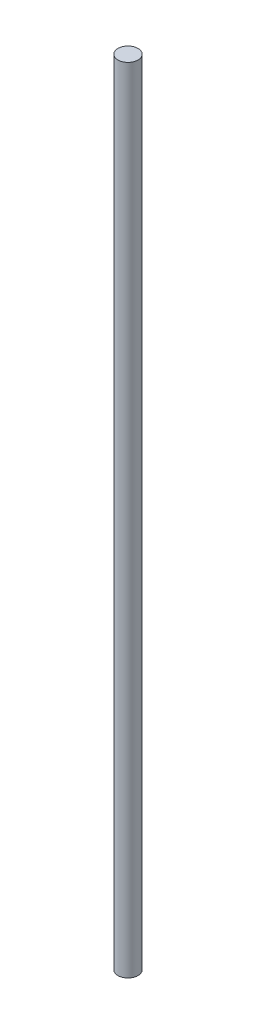
ISO-10303-21;
HEADER;
FILE_DESCRIPTION(('STEP AP214'),'2;1');
FILE_NAME('part.step','',(''),(''),'','','');
FILE_SCHEMA(('AUTOMOTIVE_DESIGN { 1 0 10303 214 1 1 1 1 }'));
ENDSEC;
DATA;
#1=APPLICATION_CONTEXT('core data for automotive mechanical design processes');
#2=APPLICATION_PROTOCOL_DEFINITION('international standard','automotive_design',2000,#1);
#3=PRODUCT_CONTEXT('',#1,'mechanical');
#4=PRODUCT('Part','Part','',(#3));
#5=PRODUCT_RELATED_PRODUCT_CATEGORY('part','',(#4));
#6=PRODUCT_DEFINITION_FORMATION('','',#4);
#7=PRODUCT_DEFINITION_CONTEXT('part definition',#1,'design');
#8=PRODUCT_DEFINITION('design','',#6,#7);
#9=PRODUCT_DEFINITION_SHAPE('','',#8);
#10=(LENGTH_UNIT() NAMED_UNIT(*) SI_UNIT(.MILLI.,.METRE.));
#11=(NAMED_UNIT(*) PLANE_ANGLE_UNIT() SI_UNIT($,.RADIAN.));
#12=(NAMED_UNIT(*) SI_UNIT($,.STERADIAN.) SOLID_ANGLE_UNIT());
#13=UNCERTAINTY_MEASURE_WITH_UNIT(LENGTH_MEASURE(1.E-05),#10,'distance_accuracy_value','');
#14=(GEOMETRIC_REPRESENTATION_CONTEXT(3) GLOBAL_UNCERTAINTY_ASSIGNED_CONTEXT((#13)) GLOBAL_UNIT_ASSIGNED_CONTEXT((#10,
#11,#12)) REPRESENTATION_CONTEXT('',''));
#15=CARTESIAN_POINT('',(0.,0.,0.));
#16=DIRECTION('',(0.,0.,1.));
#17=DIRECTION('',(1.,0.,0.));
#18=AXIS2_PLACEMENT_3D('',#15,#16,#17);
#19=CARTESIAN_POINT('',(0.,190.5,0.));
#20=DIRECTION('',(0.,-1.,0.));
#21=DIRECTION('',(0.,0.,-1.));
#22=AXIS2_PLACEMENT_3D('',#19,#20,#21);
#23=CYLINDRICAL_SURFACE('',#22,2.413);
#24=CARTESIAN_POINT('',(0.,190.5,0.));
#25=DIRECTION('',(0.,1.,0.));
#26=DIRECTION('',(0.,0.,1.));
#27=AXIS2_PLACEMENT_3D('',#24,#25,#26);
#28=CIRCLE('',#27,2.413);
#29=CARTESIAN_POINT('',(0.,190.5,2.413));
#30=VERTEX_POINT('',#29);
#31=EDGE_CURVE('E10',#30,#30,#28,.T.);
#32=ORIENTED_EDGE('',*,*,#31,.F.);
#33=EDGE_LOOP('',(#32));
#34=FACE_BOUND('',#33,.T.);
#35=CARTESIAN_POINT('',(0.,0.,0.));
#36=DIRECTION('',(0.,1.,0.));
#37=DIRECTION('',(0.,0.,1.));
#38=AXIS2_PLACEMENT_3D('',#35,#36,#37);
#39=CIRCLE('',#38,2.413);
#40=CARTESIAN_POINT('',(0.,0.,2.413));
#41=VERTEX_POINT('',#40);
#42=EDGE_CURVE('E40',#41,#41,#39,.T.);
#43=ORIENTED_EDGE('',*,*,#42,.T.);
#44=EDGE_LOOP('',(#43));
#45=FACE_BOUND('',#44,.T.);
#46=ADVANCED_FACE('F37',(#34,#45),#23,.T.);
#47=CARTESIAN_POINT('',(0.,190.5,0.));
#48=DIRECTION('',(0.,1.,0.));
#49=DIRECTION('',(0.,0.,1.));
#50=AXIS2_PLACEMENT_3D('',#47,#48,#49);
#51=PLANE('',#50);
#52=ORIENTED_EDGE('',*,*,#31,.T.);
#53=EDGE_LOOP('',(#52));
#54=FACE_BOUND('',#53,.T.);
#55=ADVANCED_FACE('F52',(#54),#51,.T.);
#56=CARTESIAN_POINT('',(0.,0.,0.));
#57=DIRECTION('',(0.,1.,0.));
#58=DIRECTION('',(0.,0.,1.));
#59=AXIS2_PLACEMENT_3D('',#56,#57,#58);
#60=PLANE('',#59);
#61=ORIENTED_EDGE('',*,*,#42,.F.);
#62=EDGE_LOOP('',(#61));
#63=FACE_BOUND('',#62,.T.);
#64=ADVANCED_FACE('F50',(#63),#60,.F.);
#65=CLOSED_SHELL('',(#46,#55,#64));
#66=MANIFOLD_SOLID_BREP('B2',#65);
#67=ADVANCED_BREP_SHAPE_REPRESENTATION('',(#18,#66),#14);
#68=SHAPE_DEFINITION_REPRESENTATION(#9,#67);
ENDSEC;
END-ISO-10303-21;
